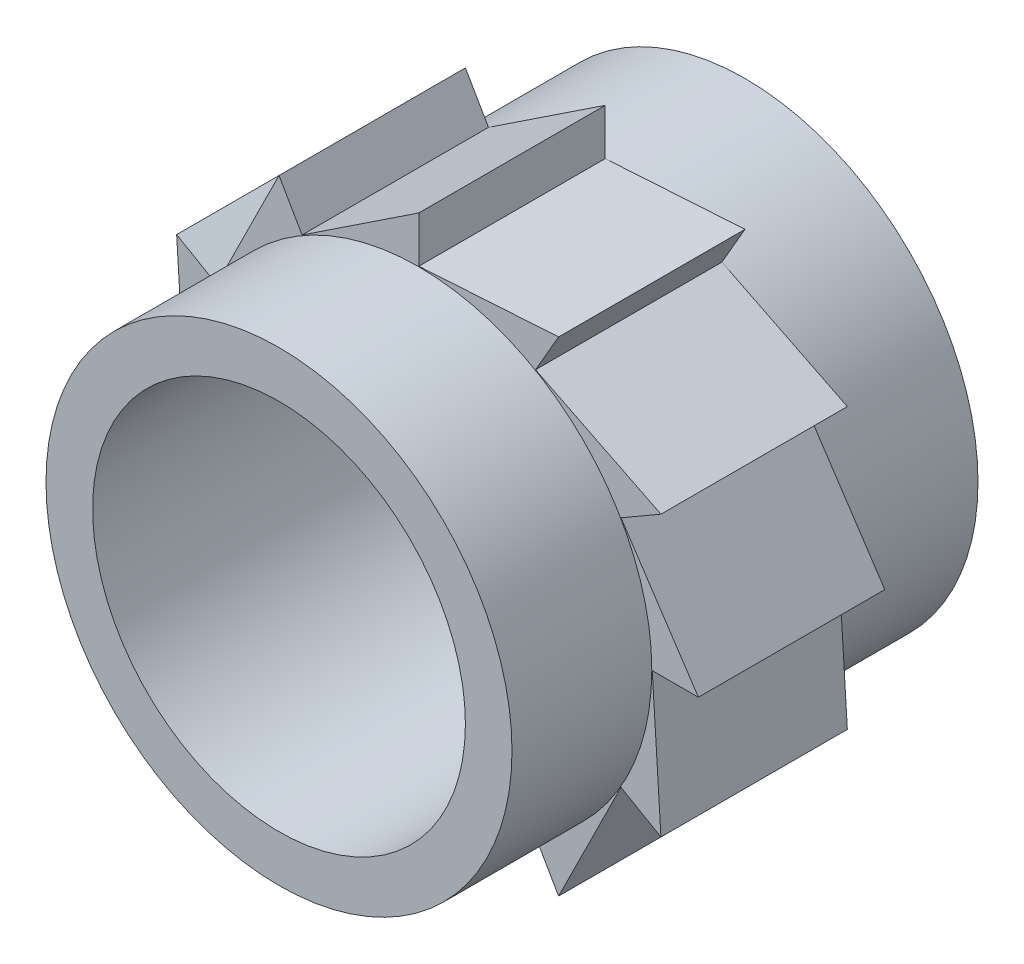
ISO-10303-21;
HEADER;
FILE_DESCRIPTION(('STEP AP214'),'2;1');
FILE_NAME('part.step','',(''),(''),'','','');
FILE_SCHEMA(('AUTOMOTIVE_DESIGN { 1 0 10303 214 1 1 1 1 }'));
ENDSEC;
DATA;
#1=APPLICATION_CONTEXT('core data for automotive mechanical design processes');
#2=APPLICATION_PROTOCOL_DEFINITION('international standard','automotive_design',2000,#1);
#3=PRODUCT_CONTEXT('',#1,'mechanical');
#4=PRODUCT('Part','Part','',(#3));
#5=PRODUCT_RELATED_PRODUCT_CATEGORY('part','',(#4));
#6=PRODUCT_DEFINITION_FORMATION('','',#4);
#7=PRODUCT_DEFINITION_CONTEXT('part definition',#1,'design');
#8=PRODUCT_DEFINITION('design','',#6,#7);
#9=PRODUCT_DEFINITION_SHAPE('','',#8);
#10=(LENGTH_UNIT() NAMED_UNIT(*) SI_UNIT(.MILLI.,.METRE.));
#11=(NAMED_UNIT(*) PLANE_ANGLE_UNIT() SI_UNIT($,.RADIAN.));
#12=(NAMED_UNIT(*) SI_UNIT($,.STERADIAN.) SOLID_ANGLE_UNIT());
#13=UNCERTAINTY_MEASURE_WITH_UNIT(LENGTH_MEASURE(1.E-05),#10,'distance_accuracy_value','');
#14=(GEOMETRIC_REPRESENTATION_CONTEXT(3) GLOBAL_UNCERTAINTY_ASSIGNED_CONTEXT((#13)) GLOBAL_UNIT_ASSIGNED_CONTEXT((#10,
#11,#12)) REPRESENTATION_CONTEXT('',''));
#15=CARTESIAN_POINT('',(0.,0.,0.));
#16=DIRECTION('',(0.,0.,1.));
#17=DIRECTION('',(1.,0.,0.));
#18=AXIS2_PLACEMENT_3D('',#15,#16,#17);
#19=CARTESIAN_POINT('',(0.,0.,50.));
#20=DIRECTION('',(0.,0.,-1.));
#21=DIRECTION('',(-1.,0.,0.));
#22=AXIS2_PLACEMENT_3D('',#19,#20,#21);
#23=CYLINDRICAL_SURFACE('',#22,50.);
#24=CARTESIAN_POINT('',(0.,0.,-50.));
#25=DIRECTION('',(0.,0.,1.));
#26=DIRECTION('',(1.,0.,0.));
#27=AXIS2_PLACEMENT_3D('',#24,#25,#26);
#28=CIRCLE('',#27,50.);
#29=CARTESIAN_POINT('',(50.,0.,-50.));
#30=VERTEX_POINT('',#29);
#31=EDGE_CURVE('E41',#30,#30,#28,.T.);
#32=ORIENTED_EDGE('',*,*,#31,.T.);
#33=EDGE_LOOP('',(#32));
#34=FACE_BOUND('',#33,.T.);
#35=CARTESIAN_POINT('',(0.,0.,-20.));
#36=DIRECTION('',(0.,0.,1.));
#37=DIRECTION('',(1.,0.,0.));
#38=AXIS2_PLACEMENT_3D('',#35,#36,#37);
#39=CIRCLE('',#38,50.);
#40=CARTESIAN_POINT('',(50.,0.,-20.));
#41=VERTEX_POINT('',#40);
#42=EDGE_CURVE('E372',#41,#41,#39,.F.);
#43=ORIENTED_EDGE('',*,*,#42,.T.);
#44=EDGE_LOOP('',(#43));
#45=FACE_BOUND('',#44,.T.);
#46=ADVANCED_FACE('F37',(#34,#45),#23,.T.);
#47=CARTESIAN_POINT('',(-27.638581289586,41.6665686600193,20.));
#48=DIRECTION('',(0.552772275896393,-0.833332353266284,0.));
#49=DIRECTION('',(0.833332353266284,0.552772275896393,0.));
#50=AXIS2_PLACEMENT_3D('',#47,#48,#49);
#51=PLANE('',#50);
#52=DIRECTION('',(0.,0.,-1.));
#53=VECTOR('',#52,1.);
#54=CARTESIAN_POINT('',(-25.0482353997359,43.3848163522864,20.));
#55=LINE('',#54,#53);
#56=CARTESIAN_POINT('',(-25.0482353997359,43.3848163522864,20.));
#57=VERTEX_POINT('',#56);
#58=CARTESIAN_POINT('',(-25.0482353997359,43.3848163522864,-20.));
#59=VERTEX_POINT('',#58);
#60=EDGE_CURVE('E52',#57,#59,#55,.T.);
#61=ORIENTED_EDGE('',*,*,#60,.F.);
#62=DIRECTION('',(-0.833332353266284,-0.552772275896393,0.));
#63=VECTOR('',#62,1.);
#64=CARTESIAN_POINT('',(-27.638581289586,41.6665686600193,20.));
#65=LINE('',#64,#63);
#66=CARTESIAN_POINT('',(0.,60.,20.));
#67=VERTEX_POINT('',#66);
#68=EDGE_CURVE('E362',#67,#57,#65,.T.);
#69=ORIENTED_EDGE('',*,*,#68,.F.);
#70=DIRECTION('',(0.,0.,-1.));
#71=VECTOR('',#70,1.);
#72=CARTESIAN_POINT('',(0.,60.,20.));
#73=LINE('',#72,#71);
#74=CARTESIAN_POINT('',(0.,60.,-20.));
#75=VERTEX_POINT('',#74);
#76=EDGE_CURVE('E370',#67,#75,#73,.T.);
#77=ORIENTED_EDGE('',*,*,#76,.T.);
#78=DIRECTION('',(-0.833332353266284,-0.552772275896393,0.));
#79=VECTOR('',#78,1.);
#80=CARTESIAN_POINT('',(-27.638581289586,41.6665686600193,-20.));
#81=LINE('',#80,#79);
#82=EDGE_CURVE('E361',#75,#59,#81,.T.);
#83=ORIENTED_EDGE('',*,*,#82,.T.);
#84=EDGE_LOOP('',(#61,#69,#77,#83));
#85=FACE_BOUND('',#84,.T.);
#86=ADVANCED_FACE('F402',(#85),#51,.F.);
#87=CARTESIAN_POINT('',(0.,0.,20.));
#88=DIRECTION('',(-1.,0.,0.));
#89=DIRECTION('',(0.,0.,1.));
#90=AXIS2_PLACEMENT_3D('',#87,#88,#89);
#91=PLANE('',#90);
#92=DIRECTION('',(0.,0.,-1.));
#93=VECTOR('',#92,1.);
#94=CARTESIAN_POINT('',(0.,50.0964707994706,20.));
#95=LINE('',#94,#93);
#96=CARTESIAN_POINT('',(0.,50.0964707994706,20.));
#97=VERTEX_POINT('',#96);
#98=CARTESIAN_POINT('',(0.,50.0964707994706,-20.));
#99=VERTEX_POINT('',#98);
#100=EDGE_CURVE('E60',#97,#99,#95,.T.);
#101=ORIENTED_EDGE('',*,*,#100,.T.);
#102=DIRECTION('',(0.,1.,0.));
#103=VECTOR('',#102,1.);
#104=CARTESIAN_POINT('',(0.,0.,-20.));
#105=LINE('',#104,#103);
#106=EDGE_CURVE('E365',#99,#75,#105,.T.);
#107=ORIENTED_EDGE('',*,*,#106,.T.);
#108=ORIENTED_EDGE('',*,*,#76,.F.);
#109=DIRECTION('',(0.,1.,0.));
#110=VECTOR('',#109,1.);
#111=CARTESIAN_POINT('',(0.,0.,20.));
#112=LINE('',#111,#110);
#113=EDGE_CURVE('E368',#97,#67,#112,.T.);
#114=ORIENTED_EDGE('',*,*,#113,.F.);
#115=EDGE_LOOP('',(#101,#107,#108,#114));
#116=FACE_BOUND('',#115,.T.);
#117=ADVANCED_FACE('F407',(#116),#91,.F.);
#118=CARTESIAN_POINT('',(0.,0.,50.));
#119=DIRECTION('',(0.,0.,1.));
#120=DIRECTION('',(1.,0.,0.));
#121=AXIS2_PLACEMENT_3D('',#118,#119,#120);
#122=PLANE('',#121);
#123=CARTESIAN_POINT('',(0.,0.,50.));
#124=DIRECTION('',(0.,0.,1.));
#125=DIRECTION('',(1.,0.,0.));
#126=AXIS2_PLACEMENT_3D('',#123,#124,#125);
#127=CIRCLE('',#126,50.);
#128=CARTESIAN_POINT('',(50.,0.,50.));
#129=VERTEX_POINT('',#128);
#130=EDGE_CURVE('E11',#129,#129,#127,.T.);
#131=ORIENTED_EDGE('',*,*,#130,.T.);
#132=EDGE_LOOP('',(#131));
#133=FACE_BOUND('',#132,.T.);
#134=CARTESIAN_POINT('',(0.,0.,50.));
#135=DIRECTION('',(0.,0.,1.));
#136=DIRECTION('',(1.,0.,0.));
#137=AXIS2_PLACEMENT_3D('',#134,#135,#136);
#138=CIRCLE('',#137,40.);
#139=CARTESIAN_POINT('',(40.,0.,50.));
#140=VERTEX_POINT('',#139);
#141=EDGE_CURVE('E379',#140,#140,#138,.T.);
#142=ORIENTED_EDGE('',*,*,#141,.F.);
#143=EDGE_LOOP('',(#142));
#144=FACE_BOUND('',#143,.T.);
#145=ADVANCED_FACE('F493',(#133,#144),#122,.T.);
#146=CARTESIAN_POINT('',(0.,0.,-50.));
#147=DIRECTION('',(0.,0.,1.));
#148=DIRECTION('',(1.,0.,0.));
#149=AXIS2_PLACEMENT_3D('',#146,#147,#148);
#150=PLANE('',#149);
#151=ORIENTED_EDGE('',*,*,#31,.F.);
#152=EDGE_LOOP('',(#151));
#153=FACE_BOUND('',#152,.T.);
#154=CARTESIAN_POINT('',(0.,0.,-50.));
#155=DIRECTION('',(0.,0.,1.));
#156=DIRECTION('',(1.,0.,0.));
#157=AXIS2_PLACEMENT_3D('',#154,#155,#156);
#158=CIRCLE('',#157,40.);
#159=CARTESIAN_POINT('',(40.,0.,-50.));
#160=VERTEX_POINT('',#159);
#161=EDGE_CURVE('E378',#160,#160,#158,.T.);
#162=ORIENTED_EDGE('',*,*,#161,.T.);
#163=EDGE_LOOP('',(#162));
#164=FACE_BOUND('',#163,.T.);
#165=ADVANCED_FACE('F385',(#153,#164),#150,.F.);
#166=CARTESIAN_POINT('',(0.,0.,20.));
#167=DIRECTION('',(0.,0.,1.));
#168=DIRECTION('',(1.,0.,0.));
#169=AXIS2_PLACEMENT_3D('',#166,#167,#168);
#170=CIRCLE('',#169,50.);
#171=CARTESIAN_POINT('',(50.,0.,20.));
#172=VERTEX_POINT('',#171);
#173=EDGE_CURVE('E364',#172,#172,#170,.F.);
#174=ORIENTED_EDGE('',*,*,#173,.F.);
#175=EDGE_LOOP('',(#174));
#176=FACE_BOUND('',#175,.T.);
#177=ORIENTED_EDGE('',*,*,#130,.F.);
#178=EDGE_LOOP('',(#177));
#179=FACE_BOUND('',#178,.T.);
#180=ADVANCED_FACE('F39',(#176,#179),#23,.T.);
#181=CARTESIAN_POINT('',(0.,0.,50.));
#182=DIRECTION('',(0.,0.,-1.));
#183=DIRECTION('',(-1.,0.,0.));
#184=AXIS2_PLACEMENT_3D('',#181,#182,#183);
#185=CYLINDRICAL_SURFACE('',#184,40.);
#186=ORIENTED_EDGE('',*,*,#141,.T.);
#187=EDGE_LOOP('',(#186));
#188=FACE_BOUND('',#187,.T.);
#189=ORIENTED_EDGE('',*,*,#161,.F.);
#190=EDGE_LOOP('',(#189));
#191=FACE_BOUND('',#190,.T.);
#192=ADVANCED_FACE('F387',(#188,#191),#185,.F.);
#193=CARTESIAN_POINT('',(0.,0.,20.));
#194=DIRECTION('',(0.,0.,1.));
#195=DIRECTION('',(1.,0.,0.));
#196=AXIS2_PLACEMENT_3D('',#193,#194,#195);
#197=PLANE('',#196);
#198=ORIENTED_EDGE('',*,*,#173,.T.);
#199=EDGE_LOOP('',(#198));
#200=FACE_BOUND('',#199,.T.);
#201=ORIENTED_EDGE('',*,*,#68,.T.);
#202=DIRECTION('',(-0.500000000000001,0.866025403784438,0.));
#203=VECTOR('',#202,1.);
#204=CARTESIAN_POINT('',(0.,0.,20.));
#205=LINE('',#204,#203);
#206=CARTESIAN_POINT('',(-30.0000000000001,51.9615242270663,20.));
#207=VERTEX_POINT('',#206);
#208=EDGE_CURVE('E353',#57,#207,#205,.T.);
#209=ORIENTED_EDGE('',*,*,#208,.T.);
#210=DIRECTION('',(-0.445300849775872,-0.895381010067159,0.));
#211=VECTOR('',#210,1.);
#212=CARTESIAN_POINT('',(-44.7689978513525,22.2650163033122,20.));
#213=LINE('',#212,#211);
#214=CARTESIAN_POINT('',(-43.3848163522872,25.0482353997346,20.));
#215=VERTEX_POINT('',#214);
#216=EDGE_CURVE('E350',#207,#215,#213,.T.);
#217=ORIENTED_EDGE('',*,*,#216,.T.);
#218=DIRECTION('',(-0.86602540378444,0.499999999999998,0.));
#219=VECTOR('',#218,1.);
#220=CARTESIAN_POINT('',(0.,0.,20.));
#221=LINE('',#220,#219);
#222=CARTESIAN_POINT('',(-51.9615242270664,29.9999999999999,20.));
#223=VERTEX_POINT('',#222);
#224=EDGE_CURVE('E341',#215,#223,#221,.T.);
#225=ORIENTED_EDGE('',*,*,#224,.T.);
#226=DIRECTION('',(0.0620486568008772,-0.998073125672266,0.));
#227=VECTOR('',#226,1.);
#228=CARTESIAN_POINT('',(-49.9035975928983,-3.10242919133322,20.));
#229=LINE('',#228,#227);
#230=CARTESIAN_POINT('',(-50.0964707994705,-8.70831184940357E-13,20.));
#231=VERTEX_POINT('',#230);
#232=EDGE_CURVE('E338',#223,#231,#229,.T.);
#233=ORIENTED_EDGE('',*,*,#232,.T.);
#234=DIRECTION('',(-1.,0.,0.));
#235=VECTOR('',#234,1.);
#236=CARTESIAN_POINT('',(0.,0.,20.));
#237=LINE('',#236,#235);
#238=CARTESIAN_POINT('',(-60.,-2.09488880330588E-13,20.));
#239=VERTEX_POINT('',#238);
#240=EDGE_CURVE('E329',#231,#239,#237,.T.);
#241=ORIENTED_EDGE('',*,*,#240,.T.);
#242=DIRECTION('',(0.552772275896396,-0.833332353266282,0.));
#243=VECTOR('',#242,1.);
#244=CARTESIAN_POINT('',(-41.6665686600192,-27.6385812895862,20.));
#245=LINE('',#244,#243);
#246=CARTESIAN_POINT('',(-43.3848163522863,-25.0482353997361,20.));
#247=VERTEX_POINT('',#246);
#248=EDGE_CURVE('E326',#239,#247,#245,.T.);
#249=ORIENTED_EDGE('',*,*,#248,.T.);
#250=DIRECTION('',(-0.866025403784436,-0.500000000000004,0.));
#251=VECTOR('',#250,1.);
#252=CARTESIAN_POINT('',(0.,0.,20.));
#253=LINE('',#252,#251);
#254=CARTESIAN_POINT('',(-51.9615242270662,-30.0000000000002,20.));
#255=VERTEX_POINT('',#254);
#256=EDGE_CURVE('E317',#247,#255,#253,.T.);
#257=ORIENTED_EDGE('',*,*,#256,.T.);
#258=DIRECTION('',(0.895381010067161,-0.445300849775869,0.));
#259=VECTOR('',#258,1.);
#260=CARTESIAN_POINT('',(-22.2650163033121,-44.7689978513526,20.));
#261=LINE('',#260,#259);
#262=CARTESIAN_POINT('',(-25.0482353997344,-43.3848163522873,20.));
#263=VERTEX_POINT('',#262);
#264=EDGE_CURVE('E314',#255,#263,#261,.T.);
#265=ORIENTED_EDGE('',*,*,#264,.T.);
#266=DIRECTION('',(-0.499999999999995,-0.866025403784442,0.));
#267=VECTOR('',#266,1.);
#268=CARTESIAN_POINT('',(0.,0.,20.));
#269=LINE('',#268,#267);
#270=CARTESIAN_POINT('',(-29.9999999999997,-51.9615242270665,20.));
#271=VERTEX_POINT('',#270);
#272=EDGE_CURVE('E305',#263,#271,#269,.T.);
#273=ORIENTED_EDGE('',*,*,#272,.T.);
#274=DIRECTION('',(0.998073125672266,0.0620486568008807,0.));
#275=VECTOR('',#274,1.);
#276=CARTESIAN_POINT('',(3.10242919133339,-49.9035975928983,20.));
#277=LINE('',#276,#275);
#278=CARTESIAN_POINT('',(0.,-50.0964707994706,20.));
#279=VERTEX_POINT('',#278);
#280=EDGE_CURVE('E302',#271,#279,#277,.T.);
#281=ORIENTED_EDGE('',*,*,#280,.T.);
#282=DIRECTION('',(0.,-1.,0.));
#283=VECTOR('',#282,1.);
#284=CARTESIAN_POINT('',(0.,0.,20.));
#285=LINE('',#284,#283);
#286=CARTESIAN_POINT('',(0.,-60.,20.));
#287=VERTEX_POINT('',#286);
#288=EDGE_CURVE('E293',#279,#287,#285,.T.);
#289=ORIENTED_EDGE('',*,*,#288,.T.);
#290=DIRECTION('',(0.833332353266284,0.552772275896393,0.));
#291=VECTOR('',#290,1.);
#292=CARTESIAN_POINT('',(27.638581289586,-41.6665686600193,20.));
#293=LINE('',#292,#291);
#294=CARTESIAN_POINT('',(25.0482353997356,-43.3848163522866,20.));
#295=VERTEX_POINT('',#294);
#296=EDGE_CURVE('E290',#287,#295,#293,.T.);
#297=ORIENTED_EDGE('',*,*,#296,.T.);
#298=DIRECTION('',(0.500000000000007,-0.866025403784435,0.));
#299=VECTOR('',#298,1.);
#300=CARTESIAN_POINT('',(0.,0.,20.));
#301=LINE('',#300,#299);
#302=CARTESIAN_POINT('',(30.0000000000004,-51.9615242270661,20.));
#303=VERTEX_POINT('',#302);
#304=EDGE_CURVE('E276',#295,#303,#301,.T.);
#305=ORIENTED_EDGE('',*,*,#304,.T.);
#306=DIRECTION('',(0.445300849775866,0.895381010067162,0.));
#307=VECTOR('',#306,1.);
#308=CARTESIAN_POINT('',(44.7689978513526,-22.2650163033119,20.));
#309=LINE('',#308,#307);
#310=CARTESIAN_POINT('',(43.3848163522871,-25.0482353997349,20.));
#311=VERTEX_POINT('',#310);
#312=EDGE_CURVE('E273',#303,#311,#309,.T.);
#313=ORIENTED_EDGE('',*,*,#312,.T.);
#314=DIRECTION('',(0.866025403784443,-0.499999999999992,0.));
#315=VECTOR('',#314,1.);
#316=CARTESIAN_POINT('',(0.,0.,20.));
#317=LINE('',#316,#315);
#318=CARTESIAN_POINT('',(51.9615242270666,-29.9999999999995,20.));
#319=VERTEX_POINT('',#318);
#320=EDGE_CURVE('E261',#311,#319,#317,.T.);
#321=ORIENTED_EDGE('',*,*,#320,.T.);
#322=DIRECTION('',(-0.0620486568008842,0.998073125672266,0.));
#323=VECTOR('',#322,1.);
#324=CARTESIAN_POINT('',(49.9035975928983,3.10242919133357,20.));
#325=LINE('',#324,#323);
#326=CARTESIAN_POINT('',(50.0964707994706,5.24743265148869E-13,20.));
#327=VERTEX_POINT('',#326);
#328=EDGE_CURVE('E258',#319,#327,#325,.T.);
#329=ORIENTED_EDGE('',*,*,#328,.T.);
#330=DIRECTION('',(1.,0.,0.));
#331=VECTOR('',#330,1.);
#332=CARTESIAN_POINT('',(0.,0.,20.));
#333=LINE('',#332,#331);
#334=CARTESIAN_POINT('',(60.,6.28466640991764E-13,20.));
#335=VERTEX_POINT('',#334);
#336=EDGE_CURVE('E246',#327,#335,#333,.T.);
#337=ORIENTED_EDGE('',*,*,#336,.T.);
#338=DIRECTION('',(-0.552772275896402,0.833332353266278,0.));
#339=VECTOR('',#338,1.);
#340=CARTESIAN_POINT('',(41.666568660019,27.6385812895865,20.));
#341=LINE('',#340,#339);
#342=CARTESIAN_POINT('',(43.3848163522866,25.0482353997358,20.));
#343=VERTEX_POINT('',#342);
#344=EDGE_CURVE('E243',#335,#343,#341,.T.);
#345=ORIENTED_EDGE('',*,*,#344,.T.);
#346=DIRECTION('',(0.866025403784433,0.50000000000001,0.));
#347=VECTOR('',#346,1.);
#348=CARTESIAN_POINT('',(0.,0.,20.));
#349=LINE('',#348,#347);
#350=CARTESIAN_POINT('',(51.961524227066,30.0000000000006,20.));
#351=VERTEX_POINT('',#350);
#352=EDGE_CURVE('E231',#343,#351,#349,.T.);
#353=ORIENTED_EDGE('',*,*,#352,.T.);
#354=DIRECTION('',(-0.895381010067164,0.445300849775863,0.));
#355=VECTOR('',#354,1.);
#356=CARTESIAN_POINT('',(22.2650163033117,44.7689978513527,20.));
#357=LINE('',#356,#355);
#358=CARTESIAN_POINT('',(25.0482353997347,43.3848163522872,20.));
#359=VERTEX_POINT('',#358);
#360=EDGE_CURVE('E206',#351,#359,#357,.T.);
#361=ORIENTED_EDGE('',*,*,#360,.T.);
#362=DIRECTION('',(0.499999999999989,0.866025403784445,0.));
#363=VECTOR('',#362,1.);
#364=CARTESIAN_POINT('',(0.,0.,20.));
#365=LINE('',#364,#363);
#366=CARTESIAN_POINT('',(29.9999999999993,51.9615242270667,20.));
#367=VERTEX_POINT('',#366);
#368=EDGE_CURVE('E200',#359,#367,#365,.T.);
#369=ORIENTED_EDGE('',*,*,#368,.T.);
#370=DIRECTION('',(-0.998073125672265,-0.0620486568008877,0.));
#371=VECTOR('',#370,1.);
#372=CARTESIAN_POINT('',(-3.10242919133374,49.9035975928982,20.));
#373=LINE('',#372,#371);
#374=EDGE_CURVE('E204',#367,#97,#373,.T.);
#375=ORIENTED_EDGE('',*,*,#374,.T.);
#376=ORIENTED_EDGE('',*,*,#113,.T.);
#377=EDGE_LOOP('',(#201,#209,#217,#225,#233,#241,#249,#257,#265,#273,#281,#289,#297,#305,#313,
#321,#329,#337,#345,#353,#361,#369,#375,#376));
#378=FACE_BOUND('',#377,.T.);
#379=ADVANCED_FACE('F202',(#200,#378),#197,.T.);
#380=CARTESIAN_POINT('',(0.,0.,-20.));
#381=DIRECTION('',(0.,0.,1.));
#382=DIRECTION('',(1.,0.,0.));
#383=AXIS2_PLACEMENT_3D('',#380,#381,#382);
#384=PLANE('',#383);
#385=ORIENTED_EDGE('',*,*,#42,.F.);
#386=EDGE_LOOP('',(#385));
#387=FACE_BOUND('',#386,.T.);
#388=ORIENTED_EDGE('',*,*,#82,.F.);
#389=ORIENTED_EDGE('',*,*,#106,.F.);
#390=DIRECTION('',(-0.998073125672265,-0.0620486568008877,0.));
#391=VECTOR('',#390,1.);
#392=CARTESIAN_POINT('',(-3.10242919133374,49.9035975928982,-20.));
#393=LINE('',#392,#391);
#394=CARTESIAN_POINT('',(29.9999999999993,51.9615242270667,-20.));
#395=VERTEX_POINT('',#394);
#396=EDGE_CURVE('E222',#395,#99,#393,.T.);
#397=ORIENTED_EDGE('',*,*,#396,.F.);
#398=DIRECTION('',(0.499999999999989,0.866025403784445,0.));
#399=VECTOR('',#398,1.);
#400=CARTESIAN_POINT('',(0.,0.,-20.));
#401=LINE('',#400,#399);
#402=CARTESIAN_POINT('',(25.0482353997347,43.3848163522872,-20.));
#403=VERTEX_POINT('',#402);
#404=EDGE_CURVE('E214',#403,#395,#401,.T.);
#405=ORIENTED_EDGE('',*,*,#404,.F.);
#406=DIRECTION('',(-0.895381010067164,0.445300849775863,0.));
#407=VECTOR('',#406,1.);
#408=CARTESIAN_POINT('',(22.2650163033117,44.7689978513527,-20.));
#409=LINE('',#408,#407);
#410=CARTESIAN_POINT('',(51.961524227066,30.0000000000006,-20.));
#411=VERTEX_POINT('',#410);
#412=EDGE_CURVE('E229',#411,#403,#409,.T.);
#413=ORIENTED_EDGE('',*,*,#412,.F.);
#414=DIRECTION('',(0.866025403784433,0.50000000000001,0.));
#415=VECTOR('',#414,1.);
#416=CARTESIAN_POINT('',(0.,0.,-20.));
#417=LINE('',#416,#415);
#418=CARTESIAN_POINT('',(43.3848163522866,25.0482353997358,-20.));
#419=VERTEX_POINT('',#418);
#420=EDGE_CURVE('E232',#419,#411,#417,.T.);
#421=ORIENTED_EDGE('',*,*,#420,.F.);
#422=DIRECTION('',(-0.552772275896402,0.833332353266278,0.));
#423=VECTOR('',#422,1.);
#424=CARTESIAN_POINT('',(41.666568660019,27.6385812895865,-20.));
#425=LINE('',#424,#423);
#426=CARTESIAN_POINT('',(60.,6.28466640991764E-13,-20.));
#427=VERTEX_POINT('',#426);
#428=EDGE_CURVE('E242',#427,#419,#425,.T.);
#429=ORIENTED_EDGE('',*,*,#428,.F.);
#430=DIRECTION('',(1.,0.,0.));
#431=VECTOR('',#430,1.);
#432=CARTESIAN_POINT('',(0.,0.,-20.));
#433=LINE('',#432,#431);
#434=CARTESIAN_POINT('',(50.0964707994706,5.24743265148869E-13,-20.));
#435=VERTEX_POINT('',#434);
#436=EDGE_CURVE('E247',#435,#427,#433,.T.);
#437=ORIENTED_EDGE('',*,*,#436,.F.);
#438=DIRECTION('',(-0.0620486568008842,0.998073125672266,0.));
#439=VECTOR('',#438,1.);
#440=CARTESIAN_POINT('',(49.9035975928983,3.10242919133357,-20.));
#441=LINE('',#440,#439);
#442=CARTESIAN_POINT('',(51.9615242270666,-29.9999999999995,-20.));
#443=VERTEX_POINT('',#442);
#444=EDGE_CURVE('E257',#443,#435,#441,.T.);
#445=ORIENTED_EDGE('',*,*,#444,.F.);
#446=DIRECTION('',(0.866025403784443,-0.499999999999992,0.));
#447=VECTOR('',#446,1.);
#448=CARTESIAN_POINT('',(0.,0.,-20.));
#449=LINE('',#448,#447);
#450=CARTESIAN_POINT('',(43.3848163522871,-25.0482353997349,-20.));
#451=VERTEX_POINT('',#450);
#452=EDGE_CURVE('E262',#451,#443,#449,.T.);
#453=ORIENTED_EDGE('',*,*,#452,.F.);
#454=DIRECTION('',(0.445300849775866,0.895381010067162,0.));
#455=VECTOR('',#454,1.);
#456=CARTESIAN_POINT('',(44.7689978513526,-22.2650163033119,-20.));
#457=LINE('',#456,#455);
#458=CARTESIAN_POINT('',(30.0000000000004,-51.9615242270661,-20.));
#459=VERTEX_POINT('',#458);
#460=EDGE_CURVE('E272',#459,#451,#457,.T.);
#461=ORIENTED_EDGE('',*,*,#460,.F.);
#462=DIRECTION('',(0.500000000000007,-0.866025403784435,0.));
#463=VECTOR('',#462,1.);
#464=CARTESIAN_POINT('',(0.,0.,-20.));
#465=LINE('',#464,#463);
#466=CARTESIAN_POINT('',(25.0482353997356,-43.3848163522866,-20.));
#467=VERTEX_POINT('',#466);
#468=EDGE_CURVE('E277',#467,#459,#465,.T.);
#469=ORIENTED_EDGE('',*,*,#468,.F.);
#470=DIRECTION('',(0.833332353266284,0.552772275896393,0.));
#471=VECTOR('',#470,1.);
#472=CARTESIAN_POINT('',(27.638581289586,-41.6665686600193,-20.));
#473=LINE('',#472,#471);
#474=CARTESIAN_POINT('',(0.,-60.,-20.));
#475=VERTEX_POINT('',#474);
#476=EDGE_CURVE('E289',#475,#467,#473,.T.);
#477=ORIENTED_EDGE('',*,*,#476,.F.);
#478=DIRECTION('',(0.,-1.,0.));
#479=VECTOR('',#478,1.);
#480=CARTESIAN_POINT('',(0.,0.,-20.));
#481=LINE('',#480,#479);
#482=CARTESIAN_POINT('',(0.,-50.0964707994706,-20.));
#483=VERTEX_POINT('',#482);
#484=EDGE_CURVE('E294',#483,#475,#481,.T.);
#485=ORIENTED_EDGE('',*,*,#484,.F.);
#486=DIRECTION('',(0.998073125672266,0.0620486568008807,0.));
#487=VECTOR('',#486,1.);
#488=CARTESIAN_POINT('',(3.10242919133339,-49.9035975928983,-20.));
#489=LINE('',#488,#487);
#490=CARTESIAN_POINT('',(-29.9999999999997,-51.9615242270665,-20.));
#491=VERTEX_POINT('',#490);
#492=EDGE_CURVE('E301',#491,#483,#489,.T.);
#493=ORIENTED_EDGE('',*,*,#492,.F.);
#494=DIRECTION('',(-0.499999999999995,-0.866025403784442,0.));
#495=VECTOR('',#494,1.);
#496=CARTESIAN_POINT('',(0.,0.,-20.));
#497=LINE('',#496,#495);
#498=CARTESIAN_POINT('',(-25.0482353997344,-43.3848163522873,-20.));
#499=VERTEX_POINT('',#498);
#500=EDGE_CURVE('E306',#499,#491,#497,.T.);
#501=ORIENTED_EDGE('',*,*,#500,.F.);
#502=DIRECTION('',(0.895381010067161,-0.445300849775869,0.));
#503=VECTOR('',#502,1.);
#504=CARTESIAN_POINT('',(-22.2650163033121,-44.7689978513526,-20.));
#505=LINE('',#504,#503);
#506=CARTESIAN_POINT('',(-51.9615242270662,-30.0000000000002,-20.));
#507=VERTEX_POINT('',#506);
#508=EDGE_CURVE('E313',#507,#499,#505,.T.);
#509=ORIENTED_EDGE('',*,*,#508,.F.);
#510=DIRECTION('',(-0.866025403784436,-0.500000000000004,0.));
#511=VECTOR('',#510,1.);
#512=CARTESIAN_POINT('',(0.,0.,-20.));
#513=LINE('',#512,#511);
#514=CARTESIAN_POINT('',(-43.3848163522863,-25.0482353997361,-20.));
#515=VERTEX_POINT('',#514);
#516=EDGE_CURVE('E318',#515,#507,#513,.T.);
#517=ORIENTED_EDGE('',*,*,#516,.F.);
#518=DIRECTION('',(0.552772275896396,-0.833332353266282,0.));
#519=VECTOR('',#518,1.);
#520=CARTESIAN_POINT('',(-41.6665686600192,-27.6385812895862,-20.));
#521=LINE('',#520,#519);
#522=CARTESIAN_POINT('',(-60.,-2.09488880330588E-13,-20.));
#523=VERTEX_POINT('',#522);
#524=EDGE_CURVE('E325',#523,#515,#521,.T.);
#525=ORIENTED_EDGE('',*,*,#524,.F.);
#526=DIRECTION('',(-1.,0.,0.));
#527=VECTOR('',#526,1.);
#528=CARTESIAN_POINT('',(0.,0.,-20.));
#529=LINE('',#528,#527);
#530=CARTESIAN_POINT('',(-50.0964707994705,-8.70831184940357E-13,-20.));
#531=VERTEX_POINT('',#530);
#532=EDGE_CURVE('E330',#531,#523,#529,.T.);
#533=ORIENTED_EDGE('',*,*,#532,.F.);
#534=DIRECTION('',(0.0620486568008772,-0.998073125672266,0.));
#535=VECTOR('',#534,1.);
#536=CARTESIAN_POINT('',(-49.9035975928983,-3.10242919133322,-20.));
#537=LINE('',#536,#535);
#538=CARTESIAN_POINT('',(-51.9615242270664,29.9999999999999,-20.));
#539=VERTEX_POINT('',#538);
#540=EDGE_CURVE('E337',#539,#531,#537,.T.);
#541=ORIENTED_EDGE('',*,*,#540,.F.);
#542=DIRECTION('',(-0.86602540378444,0.499999999999998,0.));
#543=VECTOR('',#542,1.);
#544=CARTESIAN_POINT('',(0.,0.,-20.));
#545=LINE('',#544,#543);
#546=CARTESIAN_POINT('',(-43.3848163522872,25.0482353997346,-20.));
#547=VERTEX_POINT('',#546);
#548=EDGE_CURVE('E342',#547,#539,#545,.T.);
#549=ORIENTED_EDGE('',*,*,#548,.F.);
#550=DIRECTION('',(-0.445300849775872,-0.895381010067159,0.));
#551=VECTOR('',#550,1.);
#552=CARTESIAN_POINT('',(-44.7689978513525,22.2650163033122,-20.));
#553=LINE('',#552,#551);
#554=CARTESIAN_POINT('',(-30.0000000000001,51.9615242270663,-20.));
#555=VERTEX_POINT('',#554);
#556=EDGE_CURVE('E349',#555,#547,#553,.T.);
#557=ORIENTED_EDGE('',*,*,#556,.F.);
#558=DIRECTION('',(-0.500000000000001,0.866025403784438,0.));
#559=VECTOR('',#558,1.);
#560=CARTESIAN_POINT('',(0.,0.,-20.));
#561=LINE('',#560,#559);
#562=EDGE_CURVE('E354',#59,#555,#561,.T.);
#563=ORIENTED_EDGE('',*,*,#562,.F.);
#564=EDGE_LOOP('',(#388,#389,#397,#405,#413,#421,#429,#437,#445,#453,#461,#469,#477,#485,#493,
#501,#509,#517,#525,#533,#541,#549,#557,#563));
#565=FACE_BOUND('',#564,.T.);
#566=ADVANCED_FACE('F395',(#387,#565),#384,.F.);
#567=CARTESIAN_POINT('',(-44.7689978513525,22.2650163033122,20.));
#568=DIRECTION('',(0.895381010067159,-0.445300849775872,0.));
#569=DIRECTION('',(0.445300849775872,0.895381010067159,0.));
#570=AXIS2_PLACEMENT_3D('',#567,#568,#569);
#571=PLANE('',#570);
#572=DIRECTION('',(0.,0.,-1.));
#573=VECTOR('',#572,1.);
#574=CARTESIAN_POINT('',(-43.3848163522873,25.0482353997346,20.));
#575=LINE('',#574,#573);
#576=EDGE_CURVE('E425',#215,#547,#575,.T.);
#577=ORIENTED_EDGE('',*,*,#576,.F.);
#578=ORIENTED_EDGE('',*,*,#216,.F.);
#579=DIRECTION('',(0.,0.,-1.));
#580=VECTOR('',#579,1.);
#581=CARTESIAN_POINT('',(-30.0000000000001,51.9615242270663,20.));
#582=LINE('',#581,#580);
#583=EDGE_CURVE('E356',#207,#555,#582,.T.);
#584=ORIENTED_EDGE('',*,*,#583,.T.);
#585=ORIENTED_EDGE('',*,*,#556,.T.);
#586=EDGE_LOOP('',(#577,#578,#584,#585));
#587=FACE_BOUND('',#586,.T.);
#588=ADVANCED_FACE('F415',(#587),#571,.F.);
#589=CARTESIAN_POINT('',(0.,0.,20.));
#590=DIRECTION('',(-0.866025403784438,-0.500000000000001,0.));
#591=DIRECTION('',(0.500000000000001,-0.866025403784438,0.));
#592=AXIS2_PLACEMENT_3D('',#589,#590,#591);
#593=PLANE('',#592);
#594=ORIENTED_EDGE('',*,*,#60,.T.);
#595=ORIENTED_EDGE('',*,*,#562,.T.);
#596=ORIENTED_EDGE('',*,*,#583,.F.);
#597=ORIENTED_EDGE('',*,*,#208,.F.);
#598=EDGE_LOOP('',(#594,#595,#596,#597));
#599=FACE_BOUND('',#598,.T.);
#600=ADVANCED_FACE('F423',(#599),#593,.F.);
#601=CARTESIAN_POINT('',(-49.9035975928983,-3.10242919133322,20.));
#602=DIRECTION('',(0.998073125672266,0.0620486568008772,0.));
#603=DIRECTION('',(-0.0620486568008772,0.998073125672266,0.));
#604=AXIS2_PLACEMENT_3D('',#601,#602,#603);
#605=PLANE('',#604);
#606=DIRECTION('',(0.,0.,-1.));
#607=VECTOR('',#606,1.);
#608=CARTESIAN_POINT('',(-50.0964707994706,-8.74734312761305E-13,20.));
#609=LINE('',#608,#607);
#610=EDGE_CURVE('E427',#231,#531,#609,.T.);
#611=ORIENTED_EDGE('',*,*,#610,.F.);
#612=ORIENTED_EDGE('',*,*,#232,.F.);
#613=DIRECTION('',(0.,0.,-1.));
#614=VECTOR('',#613,1.);
#615=CARTESIAN_POINT('',(-51.9615242270664,29.9999999999999,20.));
#616=LINE('',#615,#614);
#617=EDGE_CURVE('E344',#223,#539,#616,.T.);
#618=ORIENTED_EDGE('',*,*,#617,.T.);
#619=ORIENTED_EDGE('',*,*,#540,.T.);
#620=EDGE_LOOP('',(#611,#612,#618,#619));
#621=FACE_BOUND('',#620,.T.);
#622=ADVANCED_FACE('F476',(#621),#605,.F.);
#623=CARTESIAN_POINT('',(0.,0.,20.));
#624=DIRECTION('',(-0.499999999999998,-0.86602540378444,0.));
#625=DIRECTION('',(0.86602540378444,-0.499999999999998,0.));
#626=AXIS2_PLACEMENT_3D('',#623,#624,#625);
#627=PLANE('',#626);
#628=ORIENTED_EDGE('',*,*,#576,.T.);
#629=ORIENTED_EDGE('',*,*,#548,.T.);
#630=ORIENTED_EDGE('',*,*,#617,.F.);
#631=ORIENTED_EDGE('',*,*,#224,.F.);
#632=EDGE_LOOP('',(#628,#629,#630,#631));
#633=FACE_BOUND('',#632,.T.);
#634=ADVANCED_FACE('F481',(#633),#627,.F.);
#635=CARTESIAN_POINT('',(-41.6665686600192,-27.6385812895862,20.));
#636=DIRECTION('',(0.833332353266282,0.552772275896396,0.));
#637=DIRECTION('',(-0.552772275896396,0.833332353266282,0.));
#638=AXIS2_PLACEMENT_3D('',#635,#636,#637);
#639=PLANE('',#638);
#640=DIRECTION('',(0.,0.,-1.));
#641=VECTOR('',#640,1.);
#642=CARTESIAN_POINT('',(-43.3848163522864,-25.0482353997361,20.));
#643=LINE('',#642,#641);
#644=EDGE_CURVE('E432',#247,#515,#643,.T.);
#645=ORIENTED_EDGE('',*,*,#644,.F.);
#646=ORIENTED_EDGE('',*,*,#248,.F.);
#647=DIRECTION('',(0.,0.,-1.));
#648=VECTOR('',#647,1.);
#649=CARTESIAN_POINT('',(-60.,-2.09488880330588E-13,20.));
#650=LINE('',#649,#648);
#651=EDGE_CURVE('E332',#239,#523,#650,.T.);
#652=ORIENTED_EDGE('',*,*,#651,.T.);
#653=ORIENTED_EDGE('',*,*,#524,.T.);
#654=EDGE_LOOP('',(#645,#646,#652,#653));
#655=FACE_BOUND('',#654,.T.);
#656=ADVANCED_FACE('F468',(#655),#639,.F.);
#657=CARTESIAN_POINT('',(0.,0.,20.));
#658=DIRECTION('',(0.,-1.,0.));
#659=DIRECTION('',(1.,0.,0.));
#660=AXIS2_PLACEMENT_3D('',#657,#658,#659);
#661=PLANE('',#660);
#662=ORIENTED_EDGE('',*,*,#610,.T.);
#663=ORIENTED_EDGE('',*,*,#532,.T.);
#664=ORIENTED_EDGE('',*,*,#651,.F.);
#665=ORIENTED_EDGE('',*,*,#240,.F.);
#666=EDGE_LOOP('',(#662,#663,#664,#665));
#667=FACE_BOUND('',#666,.T.);
#668=ADVANCED_FACE('F473',(#667),#661,.F.);
#669=CARTESIAN_POINT('',(-22.2650163033121,-44.7689978513526,20.));
#670=DIRECTION('',(0.445300849775869,0.895381010067161,0.));
#671=DIRECTION('',(-0.895381010067161,0.445300849775869,0.));
#672=AXIS2_PLACEMENT_3D('',#669,#670,#671);
#673=PLANE('',#672);
#674=DIRECTION('',(0.,0.,-1.));
#675=VECTOR('',#674,1.);
#676=CARTESIAN_POINT('',(-25.0482353997344,-43.3848163522873,20.));
#677=LINE('',#676,#675);
#678=EDGE_CURVE('E435',#263,#499,#677,.T.);
#679=ORIENTED_EDGE('',*,*,#678,.F.);
#680=ORIENTED_EDGE('',*,*,#264,.F.);
#681=DIRECTION('',(0.,0.,-1.));
#682=VECTOR('',#681,1.);
#683=CARTESIAN_POINT('',(-51.9615242270662,-30.0000000000002,20.));
#684=LINE('',#683,#682);
#685=EDGE_CURVE('E320',#255,#507,#684,.T.);
#686=ORIENTED_EDGE('',*,*,#685,.T.);
#687=ORIENTED_EDGE('',*,*,#508,.T.);
#688=EDGE_LOOP('',(#679,#680,#686,#687));
#689=FACE_BOUND('',#688,.T.);
#690=ADVANCED_FACE('F461',(#689),#673,.F.);
#691=CARTESIAN_POINT('',(0.,0.,20.));
#692=DIRECTION('',(0.500000000000004,-0.866025403784436,0.));
#693=DIRECTION('',(0.866025403784436,0.500000000000004,0.));
#694=AXIS2_PLACEMENT_3D('',#691,#692,#693);
#695=PLANE('',#694);
#696=ORIENTED_EDGE('',*,*,#644,.T.);
#697=ORIENTED_EDGE('',*,*,#516,.T.);
#698=ORIENTED_EDGE('',*,*,#685,.F.);
#699=ORIENTED_EDGE('',*,*,#256,.F.);
#700=EDGE_LOOP('',(#696,#697,#698,#699));
#701=FACE_BOUND('',#700,.T.);
#702=ADVANCED_FACE('F463',(#701),#695,.F.);
#703=CARTESIAN_POINT('',(3.10242919133339,-49.9035975928983,20.));
#704=DIRECTION('',(-0.0620486568008807,0.998073125672266,0.));
#705=DIRECTION('',(-0.998073125672266,-0.0620486568008807,0.));
#706=AXIS2_PLACEMENT_3D('',#703,#704,#705);
#707=PLANE('',#706);
#708=DIRECTION('',(0.,0.,1.));
#709=VECTOR('',#708,1.);
#710=CARTESIAN_POINT('',(0.,-50.0964707994707,20.));
#711=LINE('',#710,#709);
#712=EDGE_CURVE('E284',#483,#279,#711,.T.);
#713=ORIENTED_EDGE('',*,*,#712,.T.);
#714=ORIENTED_EDGE('',*,*,#280,.F.);
#715=DIRECTION('',(0.,0.,-1.));
#716=VECTOR('',#715,1.);
#717=CARTESIAN_POINT('',(-29.9999999999997,-51.9615242270665,20.));
#718=LINE('',#717,#716);
#719=EDGE_CURVE('E308',#271,#491,#718,.T.);
#720=ORIENTED_EDGE('',*,*,#719,.T.);
#721=ORIENTED_EDGE('',*,*,#492,.T.);
#722=EDGE_LOOP('',(#713,#714,#720,#721));
#723=FACE_BOUND('',#722,.T.);
#724=ADVANCED_FACE('F451',(#723),#707,.F.);
#725=CARTESIAN_POINT('',(0.,0.,20.));
#726=DIRECTION('',(0.866025403784442,-0.499999999999995,0.));
#727=DIRECTION('',(0.499999999999995,0.866025403784442,0.));
#728=AXIS2_PLACEMENT_3D('',#725,#726,#727);
#729=PLANE('',#728);
#730=ORIENTED_EDGE('',*,*,#678,.T.);
#731=ORIENTED_EDGE('',*,*,#500,.T.);
#732=ORIENTED_EDGE('',*,*,#719,.F.);
#733=ORIENTED_EDGE('',*,*,#272,.F.);
#734=EDGE_LOOP('',(#730,#731,#732,#733));
#735=FACE_BOUND('',#734,.T.);
#736=ADVANCED_FACE('F440',(#735),#729,.F.);
#737=CARTESIAN_POINT('',(27.638581289586,-41.6665686600193,20.));
#738=DIRECTION('',(-0.552772275896393,0.833332353266284,0.));
#739=DIRECTION('',(-0.833332353266284,-0.552772275896393,0.));
#740=AXIS2_PLACEMENT_3D('',#737,#738,#739);
#741=PLANE('',#740);
#742=DIRECTION('',(0.,0.,-1.));
#743=VECTOR('',#742,1.);
#744=CARTESIAN_POINT('',(25.0482353997356,-43.3848163522866,20.));
#745=LINE('',#744,#743);
#746=EDGE_CURVE('E286',#295,#467,#745,.T.);
#747=ORIENTED_EDGE('',*,*,#746,.F.);
#748=ORIENTED_EDGE('',*,*,#296,.F.);
#749=DIRECTION('',(0.,0.,-1.));
#750=VECTOR('',#749,1.);
#751=CARTESIAN_POINT('',(0.,-60.,20.));
#752=LINE('',#751,#750);
#753=EDGE_CURVE('E296',#287,#475,#752,.T.);
#754=ORIENTED_EDGE('',*,*,#753,.T.);
#755=ORIENTED_EDGE('',*,*,#476,.T.);
#756=EDGE_LOOP('',(#747,#748,#754,#755));
#757=FACE_BOUND('',#756,.T.);
#758=ADVANCED_FACE('F605',(#757),#741,.F.);
#759=CARTESIAN_POINT('',(0.,0.,20.));
#760=DIRECTION('',(1.,0.,0.));
#761=DIRECTION('',(0.,0.,-1.));
#762=AXIS2_PLACEMENT_3D('',#759,#760,#761);
#763=PLANE('',#762);
#764=ORIENTED_EDGE('',*,*,#712,.F.);
#765=ORIENTED_EDGE('',*,*,#484,.T.);
#766=ORIENTED_EDGE('',*,*,#753,.F.);
#767=ORIENTED_EDGE('',*,*,#288,.F.);
#768=EDGE_LOOP('',(#764,#765,#766,#767));
#769=FACE_BOUND('',#768,.T.);
#770=ADVANCED_FACE('F455',(#769),#763,.F.);
#771=CARTESIAN_POINT('',(0.,0.,20.));
#772=DIRECTION('',(0.866025403784434,0.500000000000007,0.));
#773=DIRECTION('',(-0.500000000000007,0.866025403784435,0.));
#774=AXIS2_PLACEMENT_3D('',#771,#772,#773);
#775=PLANE('',#774);
#776=ORIENTED_EDGE('',*,*,#304,.F.);
#777=ORIENTED_EDGE('',*,*,#746,.T.);
#778=ORIENTED_EDGE('',*,*,#468,.T.);
#779=DIRECTION('',(0.,0.,-1.));
#780=VECTOR('',#779,1.);
#781=CARTESIAN_POINT('',(30.0000000000004,-51.9615242270661,20.));
#782=LINE('',#781,#780);
#783=EDGE_CURVE('E279',#303,#459,#782,.T.);
#784=ORIENTED_EDGE('',*,*,#783,.F.);
#785=EDGE_LOOP('',(#776,#777,#778,#784));
#786=FACE_BOUND('',#785,.T.);
#787=ADVANCED_FACE('F623',(#786),#775,.F.);
#788=CARTESIAN_POINT('',(44.7689978513526,-22.2650163033119,20.));
#789=DIRECTION('',(-0.895381010067162,0.445300849775866,0.));
#790=DIRECTION('',(-0.445300849775866,-0.895381010067162,0.));
#791=AXIS2_PLACEMENT_3D('',#788,#789,#790);
#792=PLANE('',#791);
#793=DIRECTION('',(0.,0.,-1.));
#794=VECTOR('',#793,1.);
#795=CARTESIAN_POINT('',(43.3848163522871,-25.0482353997349,20.));
#796=LINE('',#795,#794);
#797=EDGE_CURVE('E269',#311,#451,#796,.T.);
#798=ORIENTED_EDGE('',*,*,#797,.F.);
#799=ORIENTED_EDGE('',*,*,#312,.F.);
#800=ORIENTED_EDGE('',*,*,#783,.T.);
#801=ORIENTED_EDGE('',*,*,#460,.T.);
#802=EDGE_LOOP('',(#798,#799,#800,#801));
#803=FACE_BOUND('',#802,.T.);
#804=ADVANCED_FACE('F632',(#803),#792,.F.);
#805=CARTESIAN_POINT('',(0.,0.,20.));
#806=DIRECTION('',(0.499999999999992,0.866025403784443,0.));
#807=DIRECTION('',(-0.866025403784443,0.499999999999992,0.));
#808=AXIS2_PLACEMENT_3D('',#805,#806,#807);
#809=PLANE('',#808);
#810=ORIENTED_EDGE('',*,*,#320,.F.);
#811=ORIENTED_EDGE('',*,*,#797,.T.);
#812=ORIENTED_EDGE('',*,*,#452,.T.);
#813=DIRECTION('',(0.,0.,-1.));
#814=VECTOR('',#813,1.);
#815=CARTESIAN_POINT('',(51.9615242270666,-29.9999999999995,20.));
#816=LINE('',#815,#814);
#817=EDGE_CURVE('E264',#319,#443,#816,.T.);
#818=ORIENTED_EDGE('',*,*,#817,.F.);
#819=EDGE_LOOP('',(#810,#811,#812,#818));
#820=FACE_BOUND('',#819,.T.);
#821=ADVANCED_FACE('F642',(#820),#809,.F.);
#822=CARTESIAN_POINT('',(49.9035975928983,3.10242919133357,20.));
#823=DIRECTION('',(-0.998073125672266,-0.0620486568008842,0.));
#824=DIRECTION('',(0.0620486568008842,-0.998073125672266,0.));
#825=AXIS2_PLACEMENT_3D('',#822,#823,#824);
#826=PLANE('',#825);
#827=DIRECTION('',(0.,0.,-1.));
#828=VECTOR('',#827,1.);
#829=CARTESIAN_POINT('',(50.0964707994706,5.24753851482984E-13,20.));
#830=LINE('',#829,#828);
#831=EDGE_CURVE('E254',#327,#435,#830,.T.);
#832=ORIENTED_EDGE('',*,*,#831,.F.);
#833=ORIENTED_EDGE('',*,*,#328,.F.);
#834=ORIENTED_EDGE('',*,*,#817,.T.);
#835=ORIENTED_EDGE('',*,*,#444,.T.);
#836=EDGE_LOOP('',(#832,#833,#834,#835));
#837=FACE_BOUND('',#836,.T.);
#838=ADVANCED_FACE('F652',(#837),#826,.F.);
#839=CARTESIAN_POINT('',(0.,0.,20.));
#840=DIRECTION('',(0.,1.,0.));
#841=DIRECTION('',(-1.,0.,0.));
#842=AXIS2_PLACEMENT_3D('',#839,#840,#841);
#843=PLANE('',#842);
#844=ORIENTED_EDGE('',*,*,#336,.F.);
#845=ORIENTED_EDGE('',*,*,#831,.T.);
#846=ORIENTED_EDGE('',*,*,#436,.T.);
#847=DIRECTION('',(0.,0.,-1.));
#848=VECTOR('',#847,1.);
#849=CARTESIAN_POINT('',(60.,6.28466640991764E-13,20.));
#850=LINE('',#849,#848);
#851=EDGE_CURVE('E249',#335,#427,#850,.T.);
#852=ORIENTED_EDGE('',*,*,#851,.F.);
#853=EDGE_LOOP('',(#844,#845,#846,#852));
#854=FACE_BOUND('',#853,.T.);
#855=ADVANCED_FACE('F662',(#854),#843,.F.);
#856=CARTESIAN_POINT('',(41.666568660019,27.6385812895865,20.));
#857=DIRECTION('',(-0.833332353266278,-0.552772275896402,0.));
#858=DIRECTION('',(0.552772275896402,-0.833332353266278,0.));
#859=AXIS2_PLACEMENT_3D('',#856,#857,#858);
#860=PLANE('',#859);
#861=DIRECTION('',(0.,0.,-1.));
#862=VECTOR('',#861,1.);
#863=CARTESIAN_POINT('',(43.3848163522866,25.0482353997358,20.));
#864=LINE('',#863,#862);
#865=EDGE_CURVE('E239',#343,#419,#864,.T.);
#866=ORIENTED_EDGE('',*,*,#865,.F.);
#867=ORIENTED_EDGE('',*,*,#344,.F.);
#868=ORIENTED_EDGE('',*,*,#851,.T.);
#869=ORIENTED_EDGE('',*,*,#428,.T.);
#870=EDGE_LOOP('',(#866,#867,#868,#869));
#871=FACE_BOUND('',#870,.T.);
#872=ADVANCED_FACE('F672',(#871),#860,.F.);
#873=CARTESIAN_POINT('',(0.,0.,20.));
#874=DIRECTION('',(-0.50000000000001,0.866025403784433,0.));
#875=DIRECTION('',(-0.866025403784433,-0.50000000000001,0.));
#876=AXIS2_PLACEMENT_3D('',#873,#874,#875);
#877=PLANE('',#876);
#878=ORIENTED_EDGE('',*,*,#352,.F.);
#879=ORIENTED_EDGE('',*,*,#865,.T.);
#880=ORIENTED_EDGE('',*,*,#420,.T.);
#881=DIRECTION('',(0.,0.,-1.));
#882=VECTOR('',#881,1.);
#883=CARTESIAN_POINT('',(51.961524227066,30.0000000000006,20.));
#884=LINE('',#883,#882);
#885=EDGE_CURVE('E234',#351,#411,#884,.T.);
#886=ORIENTED_EDGE('',*,*,#885,.F.);
#887=EDGE_LOOP('',(#878,#879,#880,#886));
#888=FACE_BOUND('',#887,.T.);
#889=ADVANCED_FACE('F682',(#888),#877,.F.);
#890=CARTESIAN_POINT('',(22.2650163033117,44.7689978513527,20.));
#891=DIRECTION('',(-0.445300849775863,-0.895381010067164,0.));
#892=DIRECTION('',(0.895381010067164,-0.445300849775863,0.));
#893=AXIS2_PLACEMENT_3D('',#890,#891,#892);
#894=PLANE('',#893);
#895=DIRECTION('',(0.,0.,-1.));
#896=VECTOR('',#895,1.);
#897=CARTESIAN_POINT('',(25.0482353997347,43.3848163522872,20.));
#898=LINE('',#897,#896);
#899=EDGE_CURVE('E218',#359,#403,#898,.T.);
#900=ORIENTED_EDGE('',*,*,#899,.F.);
#901=ORIENTED_EDGE('',*,*,#360,.F.);
#902=ORIENTED_EDGE('',*,*,#885,.T.);
#903=ORIENTED_EDGE('',*,*,#412,.T.);
#904=EDGE_LOOP('',(#900,#901,#902,#903));
#905=FACE_BOUND('',#904,.T.);
#906=ADVANCED_FACE('F692',(#905),#894,.F.);
#907=CARTESIAN_POINT('',(0.,0.,20.));
#908=DIRECTION('',(-0.866025403784445,0.499999999999989,0.));
#909=DIRECTION('',(-0.499999999999989,-0.866025403784445,0.));
#910=AXIS2_PLACEMENT_3D('',#907,#908,#909);
#911=PLANE('',#910);
#912=ORIENTED_EDGE('',*,*,#368,.F.);
#913=ORIENTED_EDGE('',*,*,#899,.T.);
#914=ORIENTED_EDGE('',*,*,#404,.T.);
#915=DIRECTION('',(0.,0.,-1.));
#916=VECTOR('',#915,1.);
#917=CARTESIAN_POINT('',(29.9999999999993,51.9615242270667,20.));
#918=LINE('',#917,#916);
#919=EDGE_CURVE('E209',#367,#395,#918,.T.);
#920=ORIENTED_EDGE('',*,*,#919,.F.);
#921=EDGE_LOOP('',(#912,#913,#914,#920));
#922=FACE_BOUND('',#921,.T.);
#923=ADVANCED_FACE('F212',(#922),#911,.F.);
#924=CARTESIAN_POINT('',(-3.10242919133374,49.9035975928982,20.));
#925=DIRECTION('',(0.0620486568008877,-0.998073125672265,0.));
#926=DIRECTION('',(0.998073125672265,0.0620486568008877,0.));
#927=AXIS2_PLACEMENT_3D('',#924,#925,#926);
#928=PLANE('',#927);
#929=ORIENTED_EDGE('',*,*,#100,.F.);
#930=ORIENTED_EDGE('',*,*,#374,.F.);
#931=ORIENTED_EDGE('',*,*,#919,.T.);
#932=ORIENTED_EDGE('',*,*,#396,.T.);
#933=EDGE_LOOP('',(#929,#930,#931,#932));
#934=FACE_BOUND('',#933,.T.);
#935=ADVANCED_FACE('F220',(#934),#928,.F.);
#936=CLOSED_SHELL('',(#46,#86,#117,#145,#165,#180,#192,#379,#566,#588,#600,#622,#634,#656,#668,
#690,#702,#724,#736,#758,#770,#787,#804,#821,#838,#855,#872,#889,#906,#923,#935));
#937=MANIFOLD_SOLID_BREP('B2',#936);
#938=ADVANCED_BREP_SHAPE_REPRESENTATION('',(#18,#937),#14);
#939=SHAPE_DEFINITION_REPRESENTATION(#9,#938);
ENDSEC;
END-ISO-10303-21;
